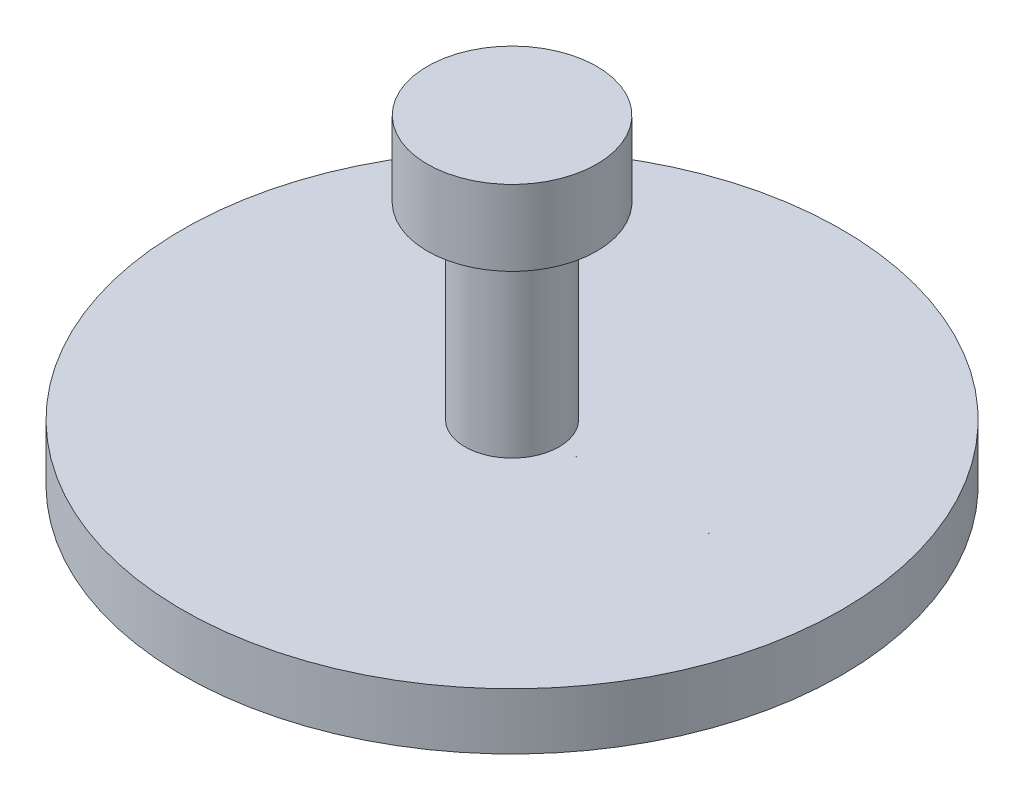
ISO-10303-21;
HEADER;
FILE_DESCRIPTION(('STEP AP214'),'2;1');
FILE_NAME('part.step','',(''),(''),'','','');
FILE_SCHEMA(('AUTOMOTIVE_DESIGN { 1 0 10303 214 1 1 1 1 }'));
ENDSEC;
DATA;
#1=APPLICATION_CONTEXT('core data for automotive mechanical design processes');
#2=APPLICATION_PROTOCOL_DEFINITION('international standard','automotive_design',2000,#1);
#3=PRODUCT_CONTEXT('',#1,'mechanical');
#4=PRODUCT('Part','Part','',(#3));
#5=PRODUCT_RELATED_PRODUCT_CATEGORY('part','',(#4));
#6=PRODUCT_DEFINITION_FORMATION('','',#4);
#7=PRODUCT_DEFINITION_CONTEXT('part definition',#1,'design');
#8=PRODUCT_DEFINITION('design','',#6,#7);
#9=PRODUCT_DEFINITION_SHAPE('','',#8);
#10=(LENGTH_UNIT() NAMED_UNIT(*) SI_UNIT(.MILLI.,.METRE.));
#11=(NAMED_UNIT(*) PLANE_ANGLE_UNIT() SI_UNIT($,.RADIAN.));
#12=(NAMED_UNIT(*) SI_UNIT($,.STERADIAN.) SOLID_ANGLE_UNIT());
#13=UNCERTAINTY_MEASURE_WITH_UNIT(LENGTH_MEASURE(1.E-05),#10,'distance_accuracy_value','');
#14=(GEOMETRIC_REPRESENTATION_CONTEXT(3) GLOBAL_UNCERTAINTY_ASSIGNED_CONTEXT((#13)) GLOBAL_UNIT_ASSIGNED_CONTEXT((#10,
#11,#12)) REPRESENTATION_CONTEXT('',''));
#15=CARTESIAN_POINT('',(0.,0.,0.));
#16=DIRECTION('',(0.,0.,1.));
#17=DIRECTION('',(1.,0.,0.));
#18=AXIS2_PLACEMENT_3D('',#15,#16,#17);
#19=CARTESIAN_POINT('',(0.,0.,0.));
#20=DIRECTION('',(0.,-1.,0.));
#21=DIRECTION('',(0.,0.,-1.));
#22=AXIS2_PLACEMENT_3D('',#19,#20,#21);
#23=PLANE('',#22);
#24=CARTESIAN_POINT('',(0.,0.,0.));
#25=DIRECTION('',(0.,-1.,0.));
#26=DIRECTION('',(0.,0.,-1.));
#27=AXIS2_PLACEMENT_3D('',#24,#25,#26);
#28=CIRCLE('',#27,17.5);
#29=CARTESIAN_POINT('',(17.4999999997535,0.,9.28756427670186E-05));
#30=VERTEX_POINT('',#29);
#31=CARTESIAN_POINT('',(17.5,0.,0.));
#32=VERTEX_POINT('',#31);
#33=EDGE_CURVE('E11',#30,#32,#28,.T.);
#34=ORIENTED_EDGE('',*,*,#33,.T.);
#35=DIRECTION('',(1.,0.,0.));
#36=VECTOR('',#35,1.);
#37=CARTESIAN_POINT('',(0.,0.,0.));
#38=LINE('',#37,#36);
#39=CARTESIAN_POINT('',(0.,0.,0.));
#40=VERTEX_POINT('',#39);
#41=EDGE_CURVE('E99',#40,#32,#38,.T.);
#42=ORIENTED_EDGE('',*,*,#41,.F.);
#43=DIRECTION('',(0.999999999985917,0.,5.30717958668678E-06));
#44=VECTOR('',#43,1.);
#45=CARTESIAN_POINT('',(0.,0.,0.));
#46=LINE('',#45,#44);
#47=EDGE_CURVE('E105',#40,#30,#46,.T.);
#48=ORIENTED_EDGE('',*,*,#47,.T.);
#49=EDGE_LOOP('',(#34,#42,#48));
#50=FACE_BOUND('',#49,.T.);
#51=ADVANCED_FACE('F41',(#50),#23,.T.);
#52=CARTESIAN_POINT('',(0.,0.,0.));
#53=DIRECTION('',(0.,-1.,0.));
#54=DIRECTION('',(0.,0.,-1.));
#55=AXIS2_PLACEMENT_3D('',#52,#53,#54);
#56=CYLINDRICAL_SURFACE('',#55,17.5);
#57=CARTESIAN_POINT('',(0.,3.,0.));
#58=DIRECTION('',(0.,-1.,0.));
#59=DIRECTION('',(0.,0.,-1.));
#60=AXIS2_PLACEMENT_3D('',#57,#58,#59);
#61=CIRCLE('',#60,17.5);
#62=CARTESIAN_POINT('',(17.4999999997535,3.,9.28756427670186E-05));
#63=VERTEX_POINT('',#62);
#64=CARTESIAN_POINT('',(17.5,3.,0.));
#65=VERTEX_POINT('',#64);
#66=EDGE_CURVE('E48',#63,#65,#61,.T.);
#67=ORIENTED_EDGE('',*,*,#66,.T.);
#68=DIRECTION('',(0.,1.,0.));
#69=VECTOR('',#68,1.);
#70=CARTESIAN_POINT('',(17.5,0.,0.));
#71=LINE('',#70,#69);
#72=EDGE_CURVE('E106',#32,#65,#71,.T.);
#73=ORIENTED_EDGE('',*,*,#72,.F.);
#74=ORIENTED_EDGE('',*,*,#33,.F.);
#75=DIRECTION('',(0.,1.,0.));
#76=VECTOR('',#75,1.);
#77=CARTESIAN_POINT('',(17.4999999997535,0.,9.28756427670186E-05));
#78=LINE('',#77,#76);
#79=EDGE_CURVE('E127',#30,#63,#78,.T.);
#80=ORIENTED_EDGE('',*,*,#79,.T.);
#81=EDGE_LOOP('',(#67,#73,#74,#80));
#82=FACE_BOUND('',#81,.T.);
#83=ADVANCED_FACE('F114',(#82),#56,.T.);
#84=CARTESIAN_POINT('',(17.4999999997535,3.,9.28756427670186E-05));
#85=DIRECTION('',(0.,1.,0.));
#86=DIRECTION('',(0.,0.,1.));
#87=AXIS2_PLACEMENT_3D('',#84,#85,#86);
#88=PLANE('',#87);
#89=CARTESIAN_POINT('',(0.,3.,0.));
#90=DIRECTION('',(0.,-1.,0.));
#91=DIRECTION('',(0.,0.,-1.));
#92=AXIS2_PLACEMENT_3D('',#89,#90,#91);
#93=CIRCLE('',#92,2.5);
#94=CARTESIAN_POINT('',(2.49999999996479,3.,1.32679489667169E-05));
#95=VERTEX_POINT('',#94);
#96=CARTESIAN_POINT('',(2.5,3.,0.));
#97=VERTEX_POINT('',#96);
#98=EDGE_CURVE('E148',#95,#97,#93,.T.);
#99=ORIENTED_EDGE('',*,*,#98,.T.);
#100=DIRECTION('',(-1.,0.,0.));
#101=VECTOR('',#100,1.);
#102=CARTESIAN_POINT('',(17.5,3.,0.));
#103=LINE('',#102,#101);
#104=EDGE_CURVE('E113',#65,#97,#103,.T.);
#105=ORIENTED_EDGE('',*,*,#104,.F.);
#106=ORIENTED_EDGE('',*,*,#66,.F.);
#107=DIRECTION('',(-0.999999999985917,0.,-5.30717958668677E-06));
#108=VECTOR('',#107,1.);
#109=CARTESIAN_POINT('',(17.4999999997535,3.,9.28756427670186E-05));
#110=LINE('',#109,#108);
#111=EDGE_CURVE('E135',#63,#95,#110,.T.);
#112=ORIENTED_EDGE('',*,*,#111,.T.);
#113=EDGE_LOOP('',(#99,#105,#106,#112));
#114=FACE_BOUND('',#113,.T.);
#115=ADVANCED_FACE('F155',(#114),#88,.T.);
#116=CARTESIAN_POINT('',(0.,0.,0.));
#117=DIRECTION('',(0.,-1.,0.));
#118=DIRECTION('',(0.,0.,-1.));
#119=AXIS2_PLACEMENT_3D('',#116,#117,#118);
#120=CYLINDRICAL_SURFACE('',#119,2.5);
#121=CARTESIAN_POINT('',(0.,13.,0.));
#122=DIRECTION('',(0.,-1.,0.));
#123=DIRECTION('',(0.,0.,-1.));
#124=AXIS2_PLACEMENT_3D('',#121,#122,#123);
#125=CIRCLE('',#124,2.5);
#126=CARTESIAN_POINT('',(2.49999999996479,13.,1.32679489667169E-05));
#127=VERTEX_POINT('',#126);
#128=CARTESIAN_POINT('',(2.5,13.,0.));
#129=VERTEX_POINT('',#128);
#130=EDGE_CURVE('E149',#127,#129,#125,.T.);
#131=ORIENTED_EDGE('',*,*,#130,.T.);
#132=DIRECTION('',(0.,1.,0.));
#133=VECTOR('',#132,1.);
#134=CARTESIAN_POINT('',(2.5,3.,0.));
#135=LINE('',#134,#133);
#136=EDGE_CURVE('E120',#97,#129,#135,.T.);
#137=ORIENTED_EDGE('',*,*,#136,.F.);
#138=ORIENTED_EDGE('',*,*,#98,.F.);
#139=DIRECTION('',(0.,1.,0.));
#140=VECTOR('',#139,1.);
#141=CARTESIAN_POINT('',(2.49999999996479,3.,1.32679489667169E-05));
#142=LINE('',#141,#140);
#143=EDGE_CURVE('E134',#95,#127,#142,.T.);
#144=ORIENTED_EDGE('',*,*,#143,.T.);
#145=EDGE_LOOP('',(#131,#137,#138,#144));
#146=FACE_BOUND('',#145,.T.);
#147=ADVANCED_FACE('F156',(#146),#120,.T.);
#148=CARTESIAN_POINT('',(2.49999999996479,13.,1.32679489667169E-05));
#149=DIRECTION('',(0.,-1.,0.));
#150=DIRECTION('',(0.,0.,-1.));
#151=AXIS2_PLACEMENT_3D('',#148,#149,#150);
#152=PLANE('',#151);
#153=CARTESIAN_POINT('',(0.,13.,0.));
#154=DIRECTION('',(0.,-1.,0.));
#155=DIRECTION('',(0.,0.,-1.));
#156=AXIS2_PLACEMENT_3D('',#153,#154,#155);
#157=CIRCLE('',#156,4.5);
#158=CARTESIAN_POINT('',(4.49999999993663,13.,2.38823081400905E-05));
#159=VERTEX_POINT('',#158);
#160=CARTESIAN_POINT('',(4.5,13.,0.));
#161=VERTEX_POINT('',#160);
#162=EDGE_CURVE('E147',#159,#161,#157,.T.);
#163=ORIENTED_EDGE('',*,*,#162,.T.);
#164=DIRECTION('',(1.,0.,0.));
#165=VECTOR('',#164,1.);
#166=CARTESIAN_POINT('',(2.5,13.,0.));
#167=LINE('',#166,#165);
#168=EDGE_CURVE('E122',#129,#161,#167,.T.);
#169=ORIENTED_EDGE('',*,*,#168,.F.);
#170=ORIENTED_EDGE('',*,*,#130,.F.);
#171=DIRECTION('',(0.999999999985917,0.,5.30717958668678E-06));
#172=VECTOR('',#171,1.);
#173=CARTESIAN_POINT('',(2.49999999996479,13.,1.32679489667169E-05));
#174=LINE('',#173,#172);
#175=EDGE_CURVE('E138',#127,#159,#174,.T.);
#176=ORIENTED_EDGE('',*,*,#175,.T.);
#177=EDGE_LOOP('',(#163,#169,#170,#176));
#178=FACE_BOUND('',#177,.T.);
#179=ADVANCED_FACE('F162',(#178),#152,.T.);
#180=CARTESIAN_POINT('',(0.,0.,0.));
#181=DIRECTION('',(0.,-1.,0.));
#182=DIRECTION('',(0.,0.,-1.));
#183=AXIS2_PLACEMENT_3D('',#180,#181,#182);
#184=CYLINDRICAL_SURFACE('',#183,4.5);
#185=CARTESIAN_POINT('',(0.,17.,0.));
#186=DIRECTION('',(0.,-1.,0.));
#187=DIRECTION('',(0.,0.,-1.));
#188=AXIS2_PLACEMENT_3D('',#185,#186,#187);
#189=CIRCLE('',#188,4.5);
#190=CARTESIAN_POINT('',(4.49999999993663,17.,2.38823081400905E-05));
#191=VERTEX_POINT('',#190);
#192=CARTESIAN_POINT('',(4.5,17.,0.));
#193=VERTEX_POINT('',#192);
#194=EDGE_CURVE('E65',#191,#193,#189,.T.);
#195=ORIENTED_EDGE('',*,*,#194,.T.);
#196=DIRECTION('',(0.,1.,0.));
#197=VECTOR('',#196,1.);
#198=CARTESIAN_POINT('',(4.5,13.,0.));
#199=LINE('',#198,#197);
#200=EDGE_CURVE('E124',#161,#193,#199,.T.);
#201=ORIENTED_EDGE('',*,*,#200,.F.);
#202=ORIENTED_EDGE('',*,*,#162,.F.);
#203=DIRECTION('',(0.,1.,0.));
#204=VECTOR('',#203,1.);
#205=CARTESIAN_POINT('',(4.49999999993663,13.,2.38823081400905E-05));
#206=LINE('',#205,#204);
#207=EDGE_CURVE('E141',#159,#191,#206,.T.);
#208=ORIENTED_EDGE('',*,*,#207,.T.);
#209=EDGE_LOOP('',(#195,#201,#202,#208));
#210=FACE_BOUND('',#209,.T.);
#211=ADVANCED_FACE('F161',(#210),#184,.T.);
#212=CARTESIAN_POINT('',(4.49999999993663,17.,2.38823081400905E-05));
#213=DIRECTION('',(0.,1.,0.));
#214=DIRECTION('',(0.,0.,1.));
#215=AXIS2_PLACEMENT_3D('',#212,#213,#214);
#216=PLANE('',#215);
#217=DIRECTION('',(-0.999999999985917,0.,-5.30717958668678E-06));
#218=VECTOR('',#217,1.);
#219=CARTESIAN_POINT('',(4.49999999993663,17.,2.38823081400905E-05));
#220=LINE('',#219,#218);
#221=CARTESIAN_POINT('',(0.,17.,0.));
#222=VERTEX_POINT('',#221);
#223=EDGE_CURVE('E142',#191,#222,#220,.T.);
#224=ORIENTED_EDGE('',*,*,#223,.T.);
#225=DIRECTION('',(-1.,0.,0.));
#226=VECTOR('',#225,1.);
#227=CARTESIAN_POINT('',(4.5,17.,0.));
#228=LINE('',#227,#226);
#229=EDGE_CURVE('E54',#193,#222,#228,.T.);
#230=ORIENTED_EDGE('',*,*,#229,.F.);
#231=ORIENTED_EDGE('',*,*,#194,.F.);
#232=EDGE_LOOP('',(#224,#230,#231));
#233=FACE_BOUND('',#232,.T.);
#234=ADVANCED_FACE('F170',(#233),#216,.T.);
#235=CARTESIAN_POINT('',(0.,0.,0.));
#236=DIRECTION('',(-5.30717958668678E-06,0.,0.999999999985917));
#237=DIRECTION('',(0.999999999985917,0.,5.30717958668678E-06));
#238=AXIS2_PLACEMENT_3D('',#235,#236,#237);
#239=PLANE('',#238);
#240=DIRECTION('',(0.,-1.,0.));
#241=VECTOR('',#240,1.);
#242=CARTESIAN_POINT('',(0.,17.,0.));
#243=LINE('',#242,#241);
#244=EDGE_CURVE('E115',#222,#40,#243,.T.);
#245=ORIENTED_EDGE('',*,*,#244,.F.);
#246=ORIENTED_EDGE('',*,*,#223,.F.);
#247=ORIENTED_EDGE('',*,*,#207,.F.);
#248=ORIENTED_EDGE('',*,*,#175,.F.);
#249=ORIENTED_EDGE('',*,*,#143,.F.);
#250=ORIENTED_EDGE('',*,*,#111,.F.);
#251=ORIENTED_EDGE('',*,*,#79,.F.);
#252=ORIENTED_EDGE('',*,*,#47,.F.);
#253=EDGE_LOOP('',(#245,#246,#247,#248,#249,#250,#251,#252));
#254=FACE_BOUND('',#253,.T.);
#255=ADVANCED_FACE('F166',(#254),#239,.F.);
#256=CARTESIAN_POINT('',(0.,0.,0.));
#257=DIRECTION('',(0.,0.,1.));
#258=DIRECTION('',(1.,0.,0.));
#259=AXIS2_PLACEMENT_3D('',#256,#257,#258);
#260=PLANE('',#259);
#261=ORIENTED_EDGE('',*,*,#244,.T.);
#262=ORIENTED_EDGE('',*,*,#41,.T.);
#263=ORIENTED_EDGE('',*,*,#72,.T.);
#264=ORIENTED_EDGE('',*,*,#104,.T.);
#265=ORIENTED_EDGE('',*,*,#136,.T.);
#266=ORIENTED_EDGE('',*,*,#168,.T.);
#267=ORIENTED_EDGE('',*,*,#200,.T.);
#268=ORIENTED_EDGE('',*,*,#229,.T.);
#269=EDGE_LOOP('',(#261,#262,#263,#264,#265,#266,#267,#268));
#270=FACE_BOUND('',#269,.T.);
#271=ADVANCED_FACE('F108',(#270),#260,.T.);
#272=CLOSED_SHELL('',(#51,#83,#115,#147,#179,#211,#234,#255,#271));
#273=MANIFOLD_SOLID_BREP('B2',#272);
#274=ADVANCED_BREP_SHAPE_REPRESENTATION('',(#18,#273),#14);
#275=SHAPE_DEFINITION_REPRESENTATION(#9,#274);
ENDSEC;
END-ISO-10303-21;
